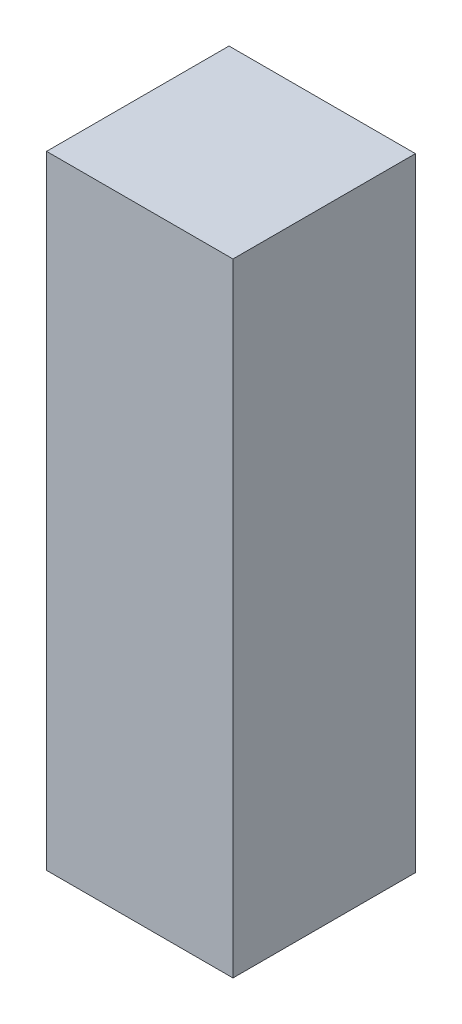
ISO-10303-21;
HEADER;
FILE_DESCRIPTION(('STEP AP214'),'2;1');
FILE_NAME('part.step','',(''),(''),'','','');
FILE_SCHEMA(('AUTOMOTIVE_DESIGN { 1 0 10303 214 1 1 1 1 }'));
ENDSEC;
DATA;
#1=APPLICATION_CONTEXT('core data for automotive mechanical design processes');
#2=APPLICATION_PROTOCOL_DEFINITION('international standard','automotive_design',2000,#1);
#3=PRODUCT_CONTEXT('',#1,'mechanical');
#4=PRODUCT('Part','Part','',(#3));
#5=PRODUCT_RELATED_PRODUCT_CATEGORY('part','',(#4));
#6=PRODUCT_DEFINITION_FORMATION('','',#4);
#7=PRODUCT_DEFINITION_CONTEXT('part definition',#1,'design');
#8=PRODUCT_DEFINITION('design','',#6,#7);
#9=PRODUCT_DEFINITION_SHAPE('','',#8);
#10=(LENGTH_UNIT() NAMED_UNIT(*) SI_UNIT(.MILLI.,.METRE.));
#11=(NAMED_UNIT(*) PLANE_ANGLE_UNIT() SI_UNIT($,.RADIAN.));
#12=(NAMED_UNIT(*) SI_UNIT($,.STERADIAN.) SOLID_ANGLE_UNIT());
#13=UNCERTAINTY_MEASURE_WITH_UNIT(LENGTH_MEASURE(1.E-05),#10,'distance_accuracy_value','');
#14=(GEOMETRIC_REPRESENTATION_CONTEXT(3) GLOBAL_UNCERTAINTY_ASSIGNED_CONTEXT((#13)) GLOBAL_UNIT_ASSIGNED_CONTEXT((#10,
#11,#12)) REPRESENTATION_CONTEXT('',''));
#15=CARTESIAN_POINT('',(0.,0.,0.));
#16=DIRECTION('',(0.,0.,1.));
#17=DIRECTION('',(1.,0.,0.));
#18=AXIS2_PLACEMENT_3D('',#15,#16,#17);
#19=CARTESIAN_POINT('',(-2.5,-77.5,229.5));
#20=DIRECTION('',(0.,0.,1.));
#21=DIRECTION('',(1.,0.,0.));
#22=AXIS2_PLACEMENT_3D('',#19,#20,#21);
#23=PLANE('',#22);
#24=DIRECTION('',(-1.,0.,0.));
#25=VECTOR('',#24,1.);
#26=CARTESIAN_POINT('',(-2.5,-77.5,229.5));
#27=LINE('',#26,#25);
#28=CARTESIAN_POINT('',(-2.5,-77.5,229.5));
#29=VERTEX_POINT('',#28);
#30=CARTESIAN_POINT('',(-49.5,-77.5,229.5));
#31=VERTEX_POINT('',#30);
#32=EDGE_CURVE('E83',#29,#31,#27,.T.);
#33=ORIENTED_EDGE('',*,*,#32,.F.);
#34=DIRECTION('',(0.,1.,0.));
#35=VECTOR('',#34,1.);
#36=CARTESIAN_POINT('',(-2.5,-77.5,229.5));
#37=LINE('',#36,#35);
#38=CARTESIAN_POINT('',(-2.5,79.5,229.5));
#39=VERTEX_POINT('',#38);
#40=EDGE_CURVE('E67',#29,#39,#37,.T.);
#41=ORIENTED_EDGE('',*,*,#40,.T.);
#42=DIRECTION('',(-1.,0.,0.));
#43=VECTOR('',#42,1.);
#44=CARTESIAN_POINT('',(-2.5,79.5,229.5));
#45=LINE('',#44,#43);
#46=CARTESIAN_POINT('',(-49.5,79.5,229.5));
#47=VERTEX_POINT('',#46);
#48=EDGE_CURVE('E78',#39,#47,#45,.T.);
#49=ORIENTED_EDGE('',*,*,#48,.T.);
#50=DIRECTION('',(0.,1.,0.));
#51=VECTOR('',#50,1.);
#52=CARTESIAN_POINT('',(-49.5,-77.5,229.5));
#53=LINE('',#52,#51);
#54=EDGE_CURVE('E9',#31,#47,#53,.T.);
#55=ORIENTED_EDGE('',*,*,#54,.F.);
#56=EDGE_LOOP('',(#33,#41,#49,#55));
#57=FACE_BOUND('',#56,.T.);
#58=ADVANCED_FACE('F14',(#57),#23,.T.);
#59=CARTESIAN_POINT('',(-2.5,-77.5,183.5));
#60=DIRECTION('',(0.,0.,1.));
#61=DIRECTION('',(1.,0.,0.));
#62=AXIS2_PLACEMENT_3D('',#59,#60,#61);
#63=PLANE('',#62);
#64=DIRECTION('',(0.,1.,0.));
#65=VECTOR('',#64,1.);
#66=CARTESIAN_POINT('',(-49.5,-77.5,183.5));
#67=LINE('',#66,#65);
#68=CARTESIAN_POINT('',(-49.5,-77.5,183.5));
#69=VERTEX_POINT('',#68);
#70=CARTESIAN_POINT('',(-49.5,79.5,183.5));
#71=VERTEX_POINT('',#70);
#72=EDGE_CURVE('E25',#69,#71,#67,.T.);
#73=ORIENTED_EDGE('',*,*,#72,.T.);
#74=DIRECTION('',(-1.,0.,0.));
#75=VECTOR('',#74,1.);
#76=CARTESIAN_POINT('',(-2.5,79.5,183.5));
#77=LINE('',#76,#75);
#78=CARTESIAN_POINT('',(-2.5,79.5,183.5));
#79=VERTEX_POINT('',#78);
#80=EDGE_CURVE('E123',#79,#71,#77,.T.);
#81=ORIENTED_EDGE('',*,*,#80,.F.);
#82=DIRECTION('',(0.,1.,0.));
#83=VECTOR('',#82,1.);
#84=CARTESIAN_POINT('',(-2.5,-77.5,183.5));
#85=LINE('',#84,#83);
#86=CARTESIAN_POINT('',(-2.5,-77.5,183.5));
#87=VERTEX_POINT('',#86);
#88=EDGE_CURVE('E77',#87,#79,#85,.T.);
#89=ORIENTED_EDGE('',*,*,#88,.F.);
#90=DIRECTION('',(-1.,0.,0.));
#91=VECTOR('',#90,1.);
#92=CARTESIAN_POINT('',(-2.5,-77.5,183.5));
#93=LINE('',#92,#91);
#94=EDGE_CURVE('E84',#87,#69,#93,.T.);
#95=ORIENTED_EDGE('',*,*,#94,.T.);
#96=EDGE_LOOP('',(#73,#81,#89,#95));
#97=FACE_BOUND('',#96,.T.);
#98=ADVANCED_FACE('F99',(#97),#63,.F.);
#99=CARTESIAN_POINT('',(-49.5,-77.5,183.5));
#100=DIRECTION('',(-1.,0.,0.));
#101=DIRECTION('',(0.,0.,1.));
#102=AXIS2_PLACEMENT_3D('',#99,#100,#101);
#103=PLANE('',#102);
#104=ORIENTED_EDGE('',*,*,#72,.F.);
#105=DIRECTION('',(0.,0.,1.));
#106=VECTOR('',#105,1.);
#107=CARTESIAN_POINT('',(-49.5,-77.5,183.5));
#108=LINE('',#107,#106);
#109=EDGE_CURVE('E88',#69,#31,#108,.T.);
#110=ORIENTED_EDGE('',*,*,#109,.T.);
#111=ORIENTED_EDGE('',*,*,#54,.T.);
#112=DIRECTION('',(0.,0.,1.));
#113=VECTOR('',#112,1.);
#114=CARTESIAN_POINT('',(-49.5,79.5,183.5));
#115=LINE('',#114,#113);
#116=EDGE_CURVE('E18',#71,#47,#115,.T.);
#117=ORIENTED_EDGE('',*,*,#116,.F.);
#118=EDGE_LOOP('',(#104,#110,#111,#117));
#119=FACE_BOUND('',#118,.T.);
#120=ADVANCED_FACE('F101',(#119),#103,.T.);
#121=CARTESIAN_POINT('',(-2.5,-77.5,183.5));
#122=DIRECTION('',(-1.,0.,0.));
#123=DIRECTION('',(0.,0.,1.));
#124=AXIS2_PLACEMENT_3D('',#121,#122,#123);
#125=PLANE('',#124);
#126=DIRECTION('',(0.,0.,1.));
#127=VECTOR('',#126,1.);
#128=CARTESIAN_POINT('',(-2.5,79.5,183.5));
#129=LINE('',#128,#127);
#130=EDGE_CURVE('E74',#79,#39,#129,.T.);
#131=ORIENTED_EDGE('',*,*,#130,.T.);
#132=ORIENTED_EDGE('',*,*,#40,.F.);
#133=DIRECTION('',(0.,0.,1.));
#134=VECTOR('',#133,1.);
#135=CARTESIAN_POINT('',(-2.5,-77.5,183.5));
#136=LINE('',#135,#134);
#137=EDGE_CURVE('E71',#87,#29,#136,.T.);
#138=ORIENTED_EDGE('',*,*,#137,.F.);
#139=ORIENTED_EDGE('',*,*,#88,.T.);
#140=EDGE_LOOP('',(#131,#132,#138,#139));
#141=FACE_BOUND('',#140,.T.);
#142=ADVANCED_FACE('F69',(#141),#125,.F.);
#143=CARTESIAN_POINT('',(-2.5,79.5,183.5));
#144=DIRECTION('',(0.,1.,0.));
#145=DIRECTION('',(1.,0.,0.));
#146=AXIS2_PLACEMENT_3D('',#143,#144,#145);
#147=PLANE('',#146);
#148=ORIENTED_EDGE('',*,*,#130,.F.);
#149=ORIENTED_EDGE('',*,*,#80,.T.);
#150=ORIENTED_EDGE('',*,*,#116,.T.);
#151=ORIENTED_EDGE('',*,*,#48,.F.);
#152=EDGE_LOOP('',(#148,#149,#150,#151));
#153=FACE_BOUND('',#152,.T.);
#154=ADVANCED_FACE('F109',(#153),#147,.T.);
#155=CARTESIAN_POINT('',(-2.5,-77.5,183.5));
#156=DIRECTION('',(0.,1.,0.));
#157=DIRECTION('',(1.,0.,0.));
#158=AXIS2_PLACEMENT_3D('',#155,#156,#157);
#159=PLANE('',#158);
#160=ORIENTED_EDGE('',*,*,#32,.T.);
#161=ORIENTED_EDGE('',*,*,#109,.F.);
#162=ORIENTED_EDGE('',*,*,#94,.F.);
#163=ORIENTED_EDGE('',*,*,#137,.T.);
#164=EDGE_LOOP('',(#160,#161,#162,#163));
#165=FACE_BOUND('',#164,.T.);
#166=ADVANCED_FACE('F16',(#165),#159,.F.);
#167=CLOSED_SHELL('',(#58,#98,#120,#142,#154,#166));
#168=MANIFOLD_SOLID_BREP('B1',#167);
#169=ADVANCED_BREP_SHAPE_REPRESENTATION('',(#18,#168),#14);
#170=SHAPE_DEFINITION_REPRESENTATION(#9,#169);
ENDSEC;
END-ISO-10303-21;
